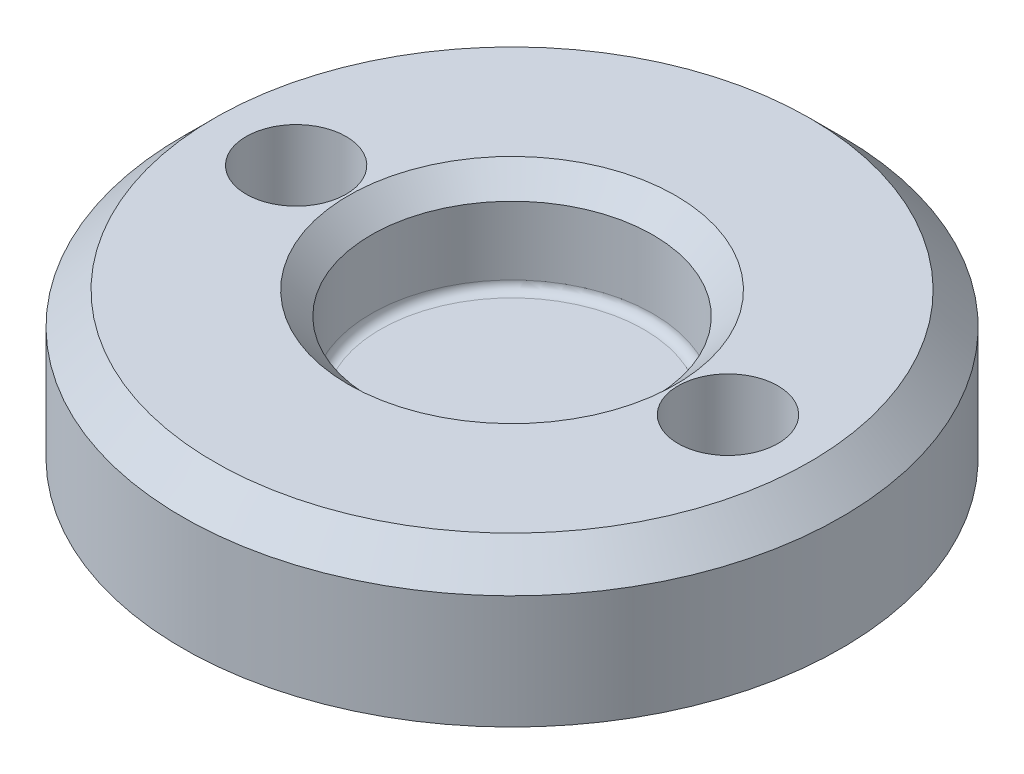
ISO-10303-21;
HEADER;
FILE_DESCRIPTION(('STEP AP214'),'2;1');
FILE_NAME('part.step','',(''),(''),'','','');
FILE_SCHEMA(('AUTOMOTIVE_DESIGN { 1 0 10303 214 1 1 1 1 }'));
ENDSEC;
DATA;
#1=APPLICATION_CONTEXT('core data for automotive mechanical design processes');
#2=APPLICATION_PROTOCOL_DEFINITION('international standard','automotive_design',2000,#1);
#3=PRODUCT_CONTEXT('',#1,'mechanical');
#4=PRODUCT('Part','Part','',(#3));
#5=PRODUCT_RELATED_PRODUCT_CATEGORY('part','',(#4));
#6=PRODUCT_DEFINITION_FORMATION('','',#4);
#7=PRODUCT_DEFINITION_CONTEXT('part definition',#1,'design');
#8=PRODUCT_DEFINITION('design','',#6,#7);
#9=PRODUCT_DEFINITION_SHAPE('','',#8);
#10=(LENGTH_UNIT() NAMED_UNIT(*) SI_UNIT(.MILLI.,.METRE.));
#11=(NAMED_UNIT(*) PLANE_ANGLE_UNIT() SI_UNIT($,.RADIAN.));
#12=(NAMED_UNIT(*) SI_UNIT($,.STERADIAN.) SOLID_ANGLE_UNIT());
#13=UNCERTAINTY_MEASURE_WITH_UNIT(LENGTH_MEASURE(1.E-05),#10,'distance_accuracy_value','');
#14=(GEOMETRIC_REPRESENTATION_CONTEXT(3) GLOBAL_UNCERTAINTY_ASSIGNED_CONTEXT((#13)) GLOBAL_UNIT_ASSIGNED_CONTEXT((#10,
#11,#12)) REPRESENTATION_CONTEXT('',''));
#15=CARTESIAN_POINT('',(0.,0.,0.));
#16=DIRECTION('',(0.,0.,1.));
#17=DIRECTION('',(1.,0.,0.));
#18=AXIS2_PLACEMENT_3D('',#15,#16,#17);
#19=CARTESIAN_POINT('',(0.,0.,0.));
#20=DIRECTION('',(0.,1.,0.));
#21=DIRECTION('',(0.,0.,1.));
#22=AXIS2_PLACEMENT_3D('',#19,#20,#21);
#23=PLANE('',#22);
#24=CARTESIAN_POINT('',(4.75,0.,0.));
#25=DIRECTION('',(0.,-1.,0.));
#26=DIRECTION('',(0.,0.,-1.));
#27=AXIS2_PLACEMENT_3D('',#24,#25,#26);
#28=CIRCLE('',#27,2.2);
#29=CARTESIAN_POINT('',(4.75,0.,-2.2));
#30=VERTEX_POINT('',#29);
#31=EDGE_CURVE('E92',#30,#30,#28,.T.);
#32=ORIENTED_EDGE('',*,*,#31,.F.);
#33=EDGE_LOOP('',(#32));
#34=FACE_BOUND('',#33,.T.);
#35=CARTESIAN_POINT('',(-4.75,0.,0.));
#36=DIRECTION('',(0.,-1.,0.));
#37=DIRECTION('',(0.,0.,-1.));
#38=AXIS2_PLACEMENT_3D('',#35,#36,#37);
#39=CIRCLE('',#38,2.2);
#40=CARTESIAN_POINT('',(-4.75,0.,-2.2));
#41=VERTEX_POINT('',#40);
#42=EDGE_CURVE('E68',#41,#41,#39,.T.);
#43=ORIENTED_EDGE('',*,*,#42,.F.);
#44=EDGE_LOOP('',(#43));
#45=FACE_BOUND('',#44,.T.);
#46=CARTESIAN_POINT('',(0.,0.,0.));
#47=DIRECTION('',(0.,-1.,0.));
#48=DIRECTION('',(0.,0.,-1.));
#49=AXIS2_PLACEMENT_3D('',#46,#47,#48);
#50=CIRCLE('',#49,7.25);
#51=CARTESIAN_POINT('',(0.,0.,-7.25));
#52=VERTEX_POINT('',#51);
#53=EDGE_CURVE('E73',#52,#52,#50,.T.);
#54=ORIENTED_EDGE('',*,*,#53,.T.);
#55=EDGE_LOOP('',(#54));
#56=FACE_BOUND('',#55,.T.);
#57=ADVANCED_FACE('F36',(#34,#45,#56),#23,.F.);
#58=CARTESIAN_POINT('',(0.,0.,0.));
#59=DIRECTION('',(0.,-1.,0.));
#60=DIRECTION('',(0.,0.,-1.));
#61=AXIS2_PLACEMENT_3D('',#58,#59,#60);
#62=CYLINDRICAL_SURFACE('',#61,7.25);
#63=CARTESIAN_POINT('',(0.,2.5,0.));
#64=DIRECTION('',(0.,-1.,0.));
#65=DIRECTION('',(0.,0.,-1.));
#66=AXIS2_PLACEMENT_3D('',#63,#64,#65);
#67=CIRCLE('',#66,7.25);
#68=CARTESIAN_POINT('',(0.,2.5,-7.25));
#69=VERTEX_POINT('',#68);
#70=EDGE_CURVE('E58',#69,#69,#67,.T.);
#71=ORIENTED_EDGE('',*,*,#70,.T.);
#72=EDGE_LOOP('',(#71));
#73=FACE_BOUND('',#72,.T.);
#74=ORIENTED_EDGE('',*,*,#53,.F.);
#75=EDGE_LOOP('',(#74));
#76=FACE_BOUND('',#75,.T.);
#77=ADVANCED_FACE('F101',(#73,#76),#62,.T.);
#78=CARTESIAN_POINT('',(-7.25,3.2,0.));
#79=DIRECTION('',(0.,-1.,0.));
#80=DIRECTION('',(0.,0.,-1.));
#81=AXIS2_PLACEMENT_3D('',#78,#79,#80);
#82=PLANE('',#81);
#83=CARTESIAN_POINT('',(0.,3.2,0.));
#84=DIRECTION('',(0.,-1.,0.));
#85=DIRECTION('',(0.,0.,-1.));
#86=AXIS2_PLACEMENT_3D('',#83,#84,#85);
#87=CIRCLE('',#86,6.55);
#88=CARTESIAN_POINT('',(0.,3.2,-6.55));
#89=VERTEX_POINT('',#88);
#90=EDGE_CURVE('E51',#89,#89,#87,.F.);
#91=ORIENTED_EDGE('',*,*,#90,.T.);
#92=EDGE_LOOP('',(#91));
#93=FACE_BOUND('',#92,.T.);
#94=CARTESIAN_POINT('',(4.75,3.2,0.));
#95=DIRECTION('',(0.,-1.,0.));
#96=DIRECTION('',(0.,0.,-1.));
#97=AXIS2_PLACEMENT_3D('',#94,#95,#96);
#98=CIRCLE('',#97,1.09999999999999);
#99=CARTESIAN_POINT('',(4.75,3.2,-1.09999999999999));
#100=VERTEX_POINT('',#99);
#101=EDGE_CURVE('E64',#100,#100,#98,.T.);
#102=ORIENTED_EDGE('',*,*,#101,.T.);
#103=EDGE_LOOP('',(#102));
#104=FACE_BOUND('',#103,.T.);
#105=CARTESIAN_POINT('',(-4.75,3.2,0.));
#106=DIRECTION('',(0.,-1.,0.));
#107=DIRECTION('',(0.,0.,-1.));
#108=AXIS2_PLACEMENT_3D('',#105,#106,#107);
#109=CIRCLE('',#108,1.09999999999999);
#110=CARTESIAN_POINT('',(-4.75,3.2,-1.09999999999999));
#111=VERTEX_POINT('',#110);
#112=EDGE_CURVE('E70',#111,#111,#109,.T.);
#113=ORIENTED_EDGE('',*,*,#112,.T.);
#114=EDGE_LOOP('',(#113));
#115=FACE_BOUND('',#114,.T.);
#116=CARTESIAN_POINT('',(0.,3.2,0.));
#117=DIRECTION('',(0.,-1.,0.));
#118=DIRECTION('',(0.,0.,-1.));
#119=AXIS2_PLACEMENT_3D('',#116,#117,#118);
#120=CIRCLE('',#119,3.6);
#121=CARTESIAN_POINT('',(0.,3.2,-3.6));
#122=VERTEX_POINT('',#121);
#123=EDGE_CURVE('E78',#122,#122,#120,.T.);
#124=ORIENTED_EDGE('',*,*,#123,.T.);
#125=EDGE_LOOP('',(#124));
#126=FACE_BOUND('',#125,.T.);
#127=ADVANCED_FACE('F108',(#93,#104,#115,#126),#82,.F.);
#128=CARTESIAN_POINT('',(0.,0.,0.));
#129=DIRECTION('',(0.,-1.,0.));
#130=DIRECTION('',(0.,0.,-1.));
#131=AXIS2_PLACEMENT_3D('',#128,#129,#130);
#132=CYLINDRICAL_SURFACE('',#131,3.1);
#133=CARTESIAN_POINT('',(0.,1.2,0.));
#134=DIRECTION('',(0.,-1.,0.));
#135=DIRECTION('',(0.,0.,-1.));
#136=AXIS2_PLACEMENT_3D('',#133,#134,#135);
#137=CIRCLE('',#136,3.1);
#138=CARTESIAN_POINT('',(0.,1.2,-3.1));
#139=VERTEX_POINT('',#138);
#140=EDGE_CURVE('E44',#139,#139,#137,.T.);
#141=ORIENTED_EDGE('',*,*,#140,.T.);
#142=EDGE_LOOP('',(#141));
#143=FACE_BOUND('',#142,.T.);
#144=CARTESIAN_POINT('',(0.,2.7,0.));
#145=DIRECTION('',(0.,-1.,0.));
#146=DIRECTION('',(0.,0.,-1.));
#147=AXIS2_PLACEMENT_3D('',#144,#145,#146);
#148=CIRCLE('',#147,3.1);
#149=CARTESIAN_POINT('',(0.,2.7,-3.1));
#150=VERTEX_POINT('',#149);
#151=EDGE_CURVE('E63',#150,#150,#148,.F.);
#152=ORIENTED_EDGE('',*,*,#151,.T.);
#153=EDGE_LOOP('',(#152));
#154=FACE_BOUND('',#153,.T.);
#155=ADVANCED_FACE('F114',(#143,#154),#132,.F.);
#156=CARTESIAN_POINT('',(-3.1,1.,0.));
#157=DIRECTION('',(0.,-1.,0.));
#158=DIRECTION('',(0.,0.,-1.));
#159=AXIS2_PLACEMENT_3D('',#156,#157,#158);
#160=PLANE('',#159);
#161=CARTESIAN_POINT('',(0.,1.,0.));
#162=DIRECTION('',(0.,-1.,0.));
#163=DIRECTION('',(0.,0.,-1.));
#164=AXIS2_PLACEMENT_3D('',#161,#162,#163);
#165=CIRCLE('',#164,2.9);
#166=CARTESIAN_POINT('',(0.,1.,-2.9));
#167=VERTEX_POINT('',#166);
#168=EDGE_CURVE('E10',#167,#167,#165,.F.);
#169=ORIENTED_EDGE('',*,*,#168,.T.);
#170=EDGE_LOOP('',(#169));
#171=FACE_BOUND('',#170,.T.);
#172=ADVANCED_FACE('F122',(#171),#160,.F.);
#173=CARTESIAN_POINT('',(0.,3.2,0.));
#174=DIRECTION('',(0.,1.,0.));
#175=DIRECTION('',(0.,0.,1.));
#176=AXIS2_PLACEMENT_3D('',#173,#174,#175);
#177=CONICAL_SURFACE('',#176,3.6,0.785398163397446);
#178=ORIENTED_EDGE('',*,*,#151,.F.);
#179=EDGE_LOOP('',(#178));
#180=FACE_BOUND('',#179,.T.);
#181=ORIENTED_EDGE('',*,*,#123,.F.);
#182=EDGE_LOOP('',(#181));
#183=FACE_BOUND('',#182,.T.);
#184=ADVANCED_FACE('F119',(#180,#183),#177,.F.);
#185=CARTESIAN_POINT('',(-4.75,0.,0.));
#186=DIRECTION('',(0.,-1.,0.));
#187=DIRECTION('',(0.,0.,-1.));
#188=AXIS2_PLACEMENT_3D('',#185,#186,#187);
#189=CYLINDRICAL_SURFACE('',#188,1.09999999999999);
#190=CARTESIAN_POINT('',(-4.75,1.1,0.));
#191=DIRECTION('',(0.,-1.,0.));
#192=DIRECTION('',(0.,0.,-1.));
#193=AXIS2_PLACEMENT_3D('',#190,#191,#192);
#194=CIRCLE('',#193,1.1);
#195=CARTESIAN_POINT('',(-4.75,1.1,-1.1));
#196=VERTEX_POINT('',#195);
#197=EDGE_CURVE('E74',#196,#196,#194,.T.);
#198=ORIENTED_EDGE('',*,*,#197,.T.);
#199=EDGE_LOOP('',(#198));
#200=FACE_BOUND('',#199,.T.);
#201=ORIENTED_EDGE('',*,*,#112,.F.);
#202=EDGE_LOOP('',(#201));
#203=FACE_BOUND('',#202,.T.);
#204=ADVANCED_FACE('F121',(#200,#203),#189,.F.);
#205=CARTESIAN_POINT('',(-4.75,0.,0.));
#206=DIRECTION('',(0.,-1.,0.));
#207=DIRECTION('',(0.,0.,-1.));
#208=AXIS2_PLACEMENT_3D('',#205,#206,#207);
#209=CONICAL_SURFACE('',#208,2.2,0.785398163397448);
#210=ORIENTED_EDGE('',*,*,#197,.F.);
#211=EDGE_LOOP('',(#210));
#212=FACE_BOUND('',#211,.T.);
#213=ORIENTED_EDGE('',*,*,#42,.T.);
#214=EDGE_LOOP('',(#213));
#215=FACE_BOUND('',#214,.T.);
#216=ADVANCED_FACE('F147',(#212,#215),#209,.F.);
#217=CARTESIAN_POINT('',(4.75,0.,0.));
#218=DIRECTION('',(0.,-1.,0.));
#219=DIRECTION('',(0.,0.,-1.));
#220=AXIS2_PLACEMENT_3D('',#217,#218,#219);
#221=CYLINDRICAL_SURFACE('',#220,1.09999999999999);
#222=CARTESIAN_POINT('',(4.75,1.1,0.));
#223=DIRECTION('',(0.,-1.,0.));
#224=DIRECTION('',(0.,0.,-1.));
#225=AXIS2_PLACEMENT_3D('',#222,#223,#224);
#226=CIRCLE('',#225,1.1);
#227=CARTESIAN_POINT('',(4.75,1.1,-1.1));
#228=VERTEX_POINT('',#227);
#229=EDGE_CURVE('E69',#228,#228,#226,.T.);
#230=ORIENTED_EDGE('',*,*,#229,.T.);
#231=EDGE_LOOP('',(#230));
#232=FACE_BOUND('',#231,.T.);
#233=ORIENTED_EDGE('',*,*,#101,.F.);
#234=EDGE_LOOP('',(#233));
#235=FACE_BOUND('',#234,.T.);
#236=ADVANCED_FACE('F132',(#232,#235),#221,.F.);
#237=CARTESIAN_POINT('',(4.75,0.,0.));
#238=DIRECTION('',(0.,-1.,0.));
#239=DIRECTION('',(0.,0.,-1.));
#240=AXIS2_PLACEMENT_3D('',#237,#238,#239);
#241=CONICAL_SURFACE('',#240,2.2,0.785398163397448);
#242=ORIENTED_EDGE('',*,*,#229,.F.);
#243=EDGE_LOOP('',(#242));
#244=FACE_BOUND('',#243,.T.);
#245=ORIENTED_EDGE('',*,*,#31,.T.);
#246=EDGE_LOOP('',(#245));
#247=FACE_BOUND('',#246,.T.);
#248=ADVANCED_FACE('F97',(#244,#247),#241,.F.);
#249=CARTESIAN_POINT('',(0.,2.5,0.));
#250=DIRECTION('',(0.,-1.,0.));
#251=DIRECTION('',(0.,0.,-1.));
#252=AXIS2_PLACEMENT_3D('',#249,#250,#251);
#253=CONICAL_SURFACE('',#252,7.25,0.78539816339745);
#254=ORIENTED_EDGE('',*,*,#90,.F.);
#255=EDGE_LOOP('',(#254));
#256=FACE_BOUND('',#255,.T.);
#257=ORIENTED_EDGE('',*,*,#70,.F.);
#258=EDGE_LOOP('',(#257));
#259=FACE_BOUND('',#258,.T.);
#260=ADVANCED_FACE('F124',(#256,#259),#253,.T.);
#261=CARTESIAN_POINT('',(0.,1.2,0.));
#262=DIRECTION('',(0.,-1.,0.));
#263=DIRECTION('',(0.,0.,-1.));
#264=AXIS2_PLACEMENT_3D('',#261,#262,#263);
#265=TOROIDAL_SURFACE('',#264,2.9,0.2);
#266=ORIENTED_EDGE('',*,*,#168,.F.);
#267=EDGE_LOOP('',(#266));
#268=FACE_BOUND('',#267,.T.);
#269=ORIENTED_EDGE('',*,*,#140,.F.);
#270=EDGE_LOOP('',(#269));
#271=FACE_BOUND('',#270,.T.);
#272=ADVANCED_FACE('F38',(#268,#271),#265,.F.);
#273=CLOSED_SHELL('',(#57,#77,#127,#155,#172,#184,#204,#216,#236,#248,#260,#272));
#274=MANIFOLD_SOLID_BREP('B2',#273);
#275=ADVANCED_BREP_SHAPE_REPRESENTATION('',(#18,#274),#14);
#276=SHAPE_DEFINITION_REPRESENTATION(#9,#275);
ENDSEC;
END-ISO-10303-21;
